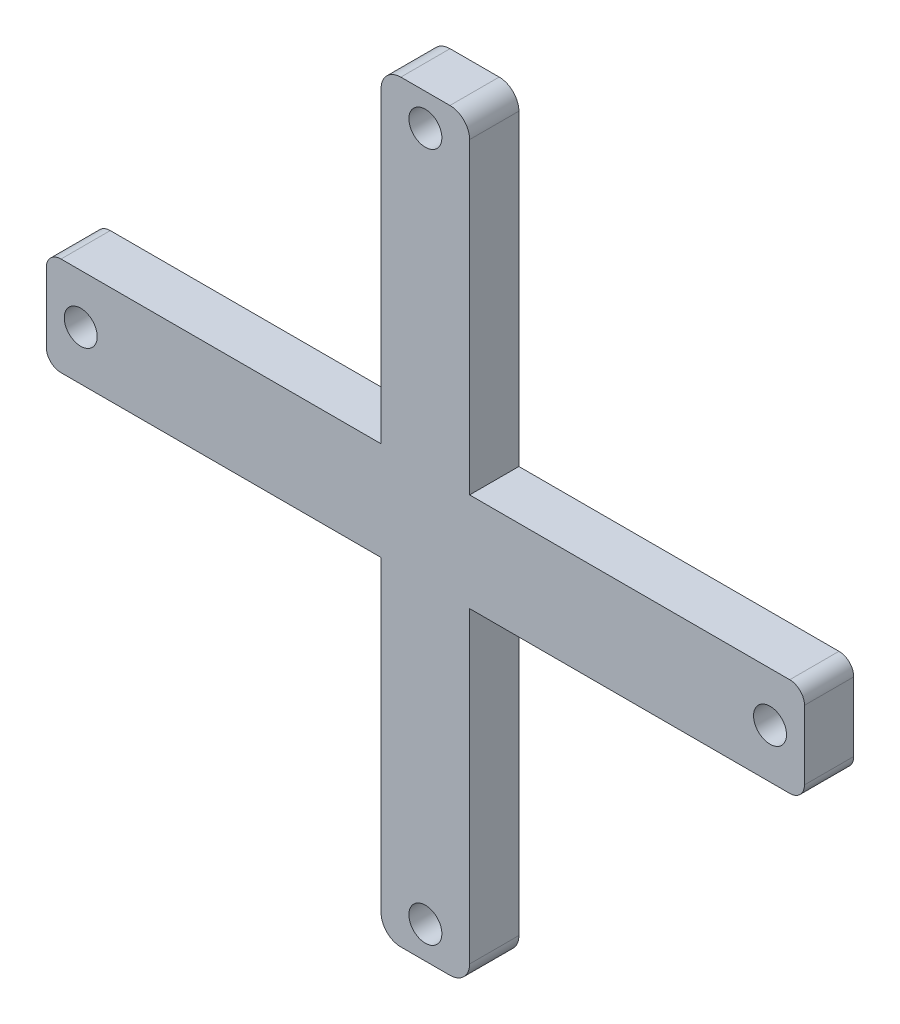
ISO-10303-21;
HEADER;
FILE_DESCRIPTION(('STEP AP214'),'2;1');
FILE_NAME('part.step','',(''),(''),'','','');
FILE_SCHEMA(('AUTOMOTIVE_DESIGN { 1 0 10303 214 1 1 1 1 }'));
ENDSEC;
DATA;
#1=APPLICATION_CONTEXT('core data for automotive mechanical design processes');
#2=APPLICATION_PROTOCOL_DEFINITION('international standard','automotive_design',2000,#1);
#3=PRODUCT_CONTEXT('',#1,'mechanical');
#4=PRODUCT('Part','Part','',(#3));
#5=PRODUCT_RELATED_PRODUCT_CATEGORY('part','',(#4));
#6=PRODUCT_DEFINITION_FORMATION('','',#4);
#7=PRODUCT_DEFINITION_CONTEXT('part definition',#1,'design');
#8=PRODUCT_DEFINITION('design','',#6,#7);
#9=PRODUCT_DEFINITION_SHAPE('','',#8);
#10=(LENGTH_UNIT() NAMED_UNIT(*) SI_UNIT(.MILLI.,.METRE.));
#11=(NAMED_UNIT(*) PLANE_ANGLE_UNIT() SI_UNIT($,.RADIAN.));
#12=(NAMED_UNIT(*) SI_UNIT($,.STERADIAN.) SOLID_ANGLE_UNIT());
#13=UNCERTAINTY_MEASURE_WITH_UNIT(LENGTH_MEASURE(1.E-05),#10,'distance_accuracy_value','');
#14=(GEOMETRIC_REPRESENTATION_CONTEXT(3) GLOBAL_UNCERTAINTY_ASSIGNED_CONTEXT((#13)) GLOBAL_UNIT_ASSIGNED_CONTEXT((#10,
#11,#12)) REPRESENTATION_CONTEXT('',''));
#15=CARTESIAN_POINT('',(0.,0.,0.));
#16=DIRECTION('',(0.,0.,1.));
#17=DIRECTION('',(1.,0.,0.));
#18=AXIS2_PLACEMENT_3D('',#15,#16,#17);
#19=CARTESIAN_POINT('',(-88.9,0.,12.7));
#20=DIRECTION('',(0.,0.,-1.));
#21=DIRECTION('',(-1.,0.,0.));
#22=AXIS2_PLACEMENT_3D('',#19,#20,#21);
#23=CYLINDRICAL_SURFACE('',#22,4.25000000000001);
#24=CARTESIAN_POINT('',(-88.9,0.,12.7));
#25=DIRECTION('',(0.,0.,1.));
#26=DIRECTION('',(1.,0.,0.));
#27=AXIS2_PLACEMENT_3D('',#24,#25,#26);
#28=CIRCLE('',#27,4.25000000000001);
#29=CARTESIAN_POINT('',(-84.65,0.,12.7));
#30=VERTEX_POINT('',#29);
#31=EDGE_CURVE('E262',#30,#30,#28,.T.);
#32=ORIENTED_EDGE('',*,*,#31,.T.);
#33=EDGE_LOOP('',(#32));
#34=FACE_BOUND('',#33,.T.);
#35=CARTESIAN_POINT('',(-88.9,0.,6.35));
#36=DIRECTION('',(0.,0.,-1.));
#37=DIRECTION('',(-1.,0.,0.));
#38=AXIS2_PLACEMENT_3D('',#35,#36,#37);
#39=CIRCLE('',#38,4.25000000000001);
#40=CARTESIAN_POINT('',(-93.15,0.,6.35));
#41=VERTEX_POINT('',#40);
#42=EDGE_CURVE('E583',#41,#41,#39,.T.);
#43=ORIENTED_EDGE('',*,*,#42,.T.);
#44=EDGE_LOOP('',(#43));
#45=FACE_BOUND('',#44,.T.);
#46=ADVANCED_FACE('F37',(#34,#45),#23,.F.);
#47=CARTESIAN_POINT('',(0.,-88.9,0.));
#48=DIRECTION('',(0.,0.,1.));
#49=DIRECTION('',(1.,0.,0.));
#50=AXIS2_PLACEMENT_3D('',#47,#48,#49);
#51=CYLINDRICAL_SURFACE('',#50,4.25);
#52=CARTESIAN_POINT('',(0.,-88.9,12.7));
#53=DIRECTION('',(0.,0.,1.));
#54=DIRECTION('',(1.,0.,0.));
#55=AXIS2_PLACEMENT_3D('',#52,#53,#54);
#56=CIRCLE('',#55,4.25);
#57=CARTESIAN_POINT('',(4.25,-88.9,12.7));
#58=VERTEX_POINT('',#57);
#59=EDGE_CURVE('E587',#58,#58,#56,.T.);
#60=ORIENTED_EDGE('',*,*,#59,.T.);
#61=EDGE_LOOP('',(#60));
#62=FACE_BOUND('',#61,.T.);
#63=CARTESIAN_POINT('',(0.,-88.9,6.35));
#64=DIRECTION('',(0.,0.,-1.));
#65=DIRECTION('',(-1.,0.,0.));
#66=AXIS2_PLACEMENT_3D('',#63,#64,#65);
#67=CIRCLE('',#66,4.25);
#68=CARTESIAN_POINT('',(-4.25,-88.9,6.35));
#69=VERTEX_POINT('',#68);
#70=EDGE_CURVE('E11',#69,#69,#67,.F.);
#71=ORIENTED_EDGE('',*,*,#70,.F.);
#72=EDGE_LOOP('',(#71));
#73=FACE_BOUND('',#72,.T.);
#74=ADVANCED_FACE('F354',(#62,#73),#51,.F.);
#75=CARTESIAN_POINT('',(88.9,0.,12.7));
#76=DIRECTION('',(0.,0.,-1.));
#77=DIRECTION('',(-1.,0.,0.));
#78=AXIS2_PLACEMENT_3D('',#75,#76,#77);
#79=CYLINDRICAL_SURFACE('',#78,4.25000000000001);
#80=CARTESIAN_POINT('',(88.9,0.,12.7));
#81=DIRECTION('',(0.,0.,1.));
#82=DIRECTION('',(1.,0.,0.));
#83=AXIS2_PLACEMENT_3D('',#80,#81,#82);
#84=CIRCLE('',#83,4.25000000000001);
#85=CARTESIAN_POINT('',(93.15,0.,12.7));
#86=VERTEX_POINT('',#85);
#87=EDGE_CURVE('E259',#86,#86,#84,.T.);
#88=ORIENTED_EDGE('',*,*,#87,.T.);
#89=EDGE_LOOP('',(#88));
#90=FACE_BOUND('',#89,.T.);
#91=CARTESIAN_POINT('',(88.9,0.,6.35));
#92=DIRECTION('',(0.,0.,-1.));
#93=DIRECTION('',(-1.,0.,0.));
#94=AXIS2_PLACEMENT_3D('',#91,#92,#93);
#95=CIRCLE('',#94,4.25000000000001);
#96=CARTESIAN_POINT('',(84.65,0.,6.35));
#97=VERTEX_POINT('',#96);
#98=EDGE_CURVE('E584',#97,#97,#95,.T.);
#99=ORIENTED_EDGE('',*,*,#98,.T.);
#100=EDGE_LOOP('',(#99));
#101=FACE_BOUND('',#100,.T.);
#102=ADVANCED_FACE('F344',(#90,#101),#79,.F.);
#103=CARTESIAN_POINT('',(0.,88.9,0.));
#104=DIRECTION('',(0.,0.,1.));
#105=DIRECTION('',(1.,0.,0.));
#106=AXIS2_PLACEMENT_3D('',#103,#104,#105);
#107=CYLINDRICAL_SURFACE('',#106,4.25);
#108=CARTESIAN_POINT('',(0.,88.9,12.7));
#109=DIRECTION('',(0.,0.,1.));
#110=DIRECTION('',(1.,0.,0.));
#111=AXIS2_PLACEMENT_3D('',#108,#109,#110);
#112=CIRCLE('',#111,4.25);
#113=CARTESIAN_POINT('',(4.25,88.9,12.7));
#114=VERTEX_POINT('',#113);
#115=EDGE_CURVE('E207',#114,#114,#112,.T.);
#116=ORIENTED_EDGE('',*,*,#115,.T.);
#117=EDGE_LOOP('',(#116));
#118=FACE_BOUND('',#117,.T.);
#119=CARTESIAN_POINT('',(0.,88.9,6.35));
#120=DIRECTION('',(0.,0.,-1.));
#121=DIRECTION('',(-1.,0.,0.));
#122=AXIS2_PLACEMENT_3D('',#119,#120,#121);
#123=CIRCLE('',#122,4.25);
#124=CARTESIAN_POINT('',(-4.25,88.9,6.35));
#125=VERTEX_POINT('',#124);
#126=EDGE_CURVE('E45',#125,#125,#123,.F.);
#127=ORIENTED_EDGE('',*,*,#126,.F.);
#128=EDGE_LOOP('',(#127));
#129=FACE_BOUND('',#128,.T.);
#130=ADVANCED_FACE('F341',(#118,#129),#107,.F.);
#131=CARTESIAN_POINT('',(93.98,12.7,12.7));
#132=DIRECTION('',(0.,-1.,0.));
#133=DIRECTION('',(1.,0.,0.));
#134=AXIS2_PLACEMENT_3D('',#131,#132,#133);
#135=PLANE('',#134);
#136=DIRECTION('',(-1.,0.,0.));
#137=VECTOR('',#136,1.);
#138=CARTESIAN_POINT('',(93.98,12.7,12.7));
#139=LINE('',#138,#137);
#140=CARTESIAN_POINT('',(-11.4153842055131,12.7,12.7));
#141=VERTEX_POINT('',#140);
#142=CARTESIAN_POINT('',(-93.98,12.7,12.7));
#143=VERTEX_POINT('',#142);
#144=EDGE_CURVE('E269',#141,#143,#139,.T.);
#145=ORIENTED_EDGE('',*,*,#144,.F.);
#146=DIRECTION('',(0.,0.,-1.));
#147=VECTOR('',#146,1.);
#148=CARTESIAN_POINT('',(-11.4153842055131,12.7,12.7));
#149=LINE('',#148,#147);
#150=CARTESIAN_POINT('',(-11.4153842055131,12.7,0.));
#151=VERTEX_POINT('',#150);
#152=EDGE_CURVE('E256',#141,#151,#149,.T.);
#153=ORIENTED_EDGE('',*,*,#152,.T.);
#154=DIRECTION('',(-1.,0.,0.));
#155=VECTOR('',#154,1.);
#156=CARTESIAN_POINT('',(93.98,12.7,0.));
#157=LINE('',#156,#155);
#158=CARTESIAN_POINT('',(-93.98,12.7,0.));
#159=VERTEX_POINT('',#158);
#160=EDGE_CURVE('E291',#151,#159,#157,.T.);
#161=ORIENTED_EDGE('',*,*,#160,.T.);
#162=DIRECTION('',(0.,0.,-1.));
#163=VECTOR('',#162,1.);
#164=CARTESIAN_POINT('',(-93.98,12.7,12.7));
#165=LINE('',#164,#163);
#166=EDGE_CURVE('E325',#143,#159,#165,.T.);
#167=ORIENTED_EDGE('',*,*,#166,.F.);
#168=EDGE_LOOP('',(#145,#153,#161,#167));
#169=FACE_BOUND('',#168,.T.);
#170=ADVANCED_FACE('F343',(#169),#135,.F.);
#171=CARTESIAN_POINT('',(93.98,-12.7,12.7));
#172=DIRECTION('',(0.,1.,0.));
#173=DIRECTION('',(-1.,0.,0.));
#174=AXIS2_PLACEMENT_3D('',#171,#172,#173);
#175=PLANE('',#174);
#176=DIRECTION('',(1.,0.,0.));
#177=VECTOR('',#176,1.);
#178=CARTESIAN_POINT('',(93.98,-12.7,0.));
#179=LINE('',#178,#177);
#180=CARTESIAN_POINT('',(-93.98,-12.7,0.));
#181=VERTEX_POINT('',#180);
#182=CARTESIAN_POINT('',(-11.4153842055131,-12.7,0.));
#183=VERTEX_POINT('',#182);
#184=EDGE_CURVE('E302',#181,#183,#179,.T.);
#185=ORIENTED_EDGE('',*,*,#184,.T.);
#186=DIRECTION('',(0.,0.,1.));
#187=VECTOR('',#186,1.);
#188=CARTESIAN_POINT('',(-11.4153842055131,-12.7,12.7));
#189=LINE('',#188,#187);
#190=CARTESIAN_POINT('',(-11.4153842055131,-12.7,12.7));
#191=VERTEX_POINT('',#190);
#192=EDGE_CURVE('E334',#183,#191,#189,.T.);
#193=ORIENTED_EDGE('',*,*,#192,.T.);
#194=DIRECTION('',(1.,0.,0.));
#195=VECTOR('',#194,1.);
#196=CARTESIAN_POINT('',(93.98,-12.7,12.7));
#197=LINE('',#196,#195);
#198=CARTESIAN_POINT('',(-93.98,-12.7,12.7));
#199=VERTEX_POINT('',#198);
#200=EDGE_CURVE('E281',#199,#191,#197,.T.);
#201=ORIENTED_EDGE('',*,*,#200,.F.);
#202=DIRECTION('',(0.,0.,-1.));
#203=VECTOR('',#202,1.);
#204=CARTESIAN_POINT('',(-93.98,-12.7,12.7));
#205=LINE('',#204,#203);
#206=EDGE_CURVE('E316',#199,#181,#205,.T.);
#207=ORIENTED_EDGE('',*,*,#206,.T.);
#208=EDGE_LOOP('',(#185,#193,#201,#207));
#209=FACE_BOUND('',#208,.T.);
#210=ADVANCED_FACE('F351',(#209),#175,.F.);
#211=CARTESIAN_POINT('',(93.98,8.89000000000001,12.7));
#212=DIRECTION('',(0.,0.,1.));
#213=DIRECTION('',(1.,0.,0.));
#214=AXIS2_PLACEMENT_3D('',#211,#212,#213);
#215=PLANE('',#214);
#216=CARTESIAN_POINT('',(93.98,12.7,12.7));
#217=VERTEX_POINT('',#216);
#218=CARTESIAN_POINT('',(11.4153842055131,12.7,12.7));
#219=VERTEX_POINT('',#218);
#220=EDGE_CURVE('E271',#217,#219,#139,.T.);
#221=ORIENTED_EDGE('',*,*,#220,.T.);
#222=DIRECTION('',(0.,1.,0.));
#223=VECTOR('',#222,1.);
#224=CARTESIAN_POINT('',(11.4153842055131,-92.075,12.7));
#225=LINE('',#224,#223);
#226=CARTESIAN_POINT('',(11.4153842055131,92.075,12.7));
#227=VERTEX_POINT('',#226);
#228=EDGE_CURVE('E230',#219,#227,#225,.T.);
#229=ORIENTED_EDGE('',*,*,#228,.T.);
#230=CARTESIAN_POINT('',(6.33538420551314,92.075,12.7));
#231=DIRECTION('',(0.,0.,1.));
#232=DIRECTION('',(-1.,0.,0.));
#233=AXIS2_PLACEMENT_3D('',#230,#231,#232);
#234=CIRCLE('',#233,5.08000000000001);
#235=CARTESIAN_POINT('',(6.33538420551314,97.155,12.7));
#236=VERTEX_POINT('',#235);
#237=EDGE_CURVE('E232',#227,#236,#234,.T.);
#238=ORIENTED_EDGE('',*,*,#237,.T.);
#239=DIRECTION('',(-1.,0.,0.));
#240=VECTOR('',#239,1.);
#241=CARTESIAN_POINT('',(-6.33538420551314,97.155,12.7));
#242=LINE('',#241,#240);
#243=CARTESIAN_POINT('',(-6.33538420551314,97.155,12.7));
#244=VERTEX_POINT('',#243);
#245=EDGE_CURVE('E235',#236,#244,#242,.T.);
#246=ORIENTED_EDGE('',*,*,#245,.T.);
#247=CARTESIAN_POINT('',(-6.33538420551314,92.075,12.7));
#248=DIRECTION('',(0.,0.,1.));
#249=DIRECTION('',(-1.,0.,0.));
#250=AXIS2_PLACEMENT_3D('',#247,#248,#249);
#251=CIRCLE('',#250,5.08000000000001);
#252=CARTESIAN_POINT('',(-11.4153842055131,92.075,12.7));
#253=VERTEX_POINT('',#252);
#254=EDGE_CURVE('E238',#244,#253,#251,.T.);
#255=ORIENTED_EDGE('',*,*,#254,.T.);
#256=DIRECTION('',(0.,-1.,0.));
#257=VECTOR('',#256,1.);
#258=CARTESIAN_POINT('',(-11.4153842055131,-92.075,12.7));
#259=LINE('',#258,#257);
#260=EDGE_CURVE('E52',#253,#141,#259,.T.);
#261=ORIENTED_EDGE('',*,*,#260,.T.);
#262=ORIENTED_EDGE('',*,*,#144,.T.);
#263=CARTESIAN_POINT('',(-93.98,8.88999999999999,12.7));
#264=DIRECTION('',(0.,0.,1.));
#265=DIRECTION('',(1.,0.,0.));
#266=AXIS2_PLACEMENT_3D('',#263,#264,#265);
#267=CIRCLE('',#266,3.81);
#268=CARTESIAN_POINT('',(-97.79,8.88999999999999,12.7));
#269=VERTEX_POINT('',#268);
#270=EDGE_CURVE('E274',#143,#269,#267,.T.);
#271=ORIENTED_EDGE('',*,*,#270,.T.);
#272=DIRECTION('',(0.,-1.,0.));
#273=VECTOR('',#272,1.);
#274=CARTESIAN_POINT('',(-97.79,-8.89000000000001,12.7));
#275=LINE('',#274,#273);
#276=CARTESIAN_POINT('',(-97.79,-8.89000000000001,12.7));
#277=VERTEX_POINT('',#276);
#278=EDGE_CURVE('E276',#269,#277,#275,.T.);
#279=ORIENTED_EDGE('',*,*,#278,.T.);
#280=CARTESIAN_POINT('',(-93.98,-8.89000000000001,12.7));
#281=DIRECTION('',(0.,0.,1.));
#282=DIRECTION('',(-1.,0.,0.));
#283=AXIS2_PLACEMENT_3D('',#280,#281,#282);
#284=CIRCLE('',#283,3.81);
#285=EDGE_CURVE('E278',#277,#199,#284,.T.);
#286=ORIENTED_EDGE('',*,*,#285,.T.);
#287=ORIENTED_EDGE('',*,*,#200,.T.);
#288=CARTESIAN_POINT('',(-11.4153842055131,-92.075,12.7));
#289=VERTEX_POINT('',#288);
#290=EDGE_CURVE('E204',#191,#289,#259,.T.);
#291=ORIENTED_EDGE('',*,*,#290,.T.);
#292=CARTESIAN_POINT('',(-6.33538420551314,-92.075,12.7));
#293=DIRECTION('',(0.,0.,1.));
#294=DIRECTION('',(-1.,0.,0.));
#295=AXIS2_PLACEMENT_3D('',#292,#293,#294);
#296=CIRCLE('',#295,5.07999999999999);
#297=CARTESIAN_POINT('',(-6.33538420551314,-97.155,12.7));
#298=VERTEX_POINT('',#297);
#299=EDGE_CURVE('E225',#289,#298,#296,.T.);
#300=ORIENTED_EDGE('',*,*,#299,.T.);
#301=DIRECTION('',(1.,0.,0.));
#302=VECTOR('',#301,1.);
#303=CARTESIAN_POINT('',(-6.33538420551314,-97.155,12.7));
#304=LINE('',#303,#302);
#305=CARTESIAN_POINT('',(6.33538420551314,-97.155,12.7));
#306=VERTEX_POINT('',#305);
#307=EDGE_CURVE('E180',#298,#306,#304,.T.);
#308=ORIENTED_EDGE('',*,*,#307,.T.);
#309=CARTESIAN_POINT('',(6.33538420551314,-92.075,12.7));
#310=DIRECTION('',(0.,0.,1.));
#311=DIRECTION('',(1.,0.,0.));
#312=AXIS2_PLACEMENT_3D('',#309,#310,#311);
#313=CIRCLE('',#312,5.07999999999999);
#314=CARTESIAN_POINT('',(11.4153842055131,-92.075,12.7));
#315=VERTEX_POINT('',#314);
#316=EDGE_CURVE('E228',#306,#315,#313,.T.);
#317=ORIENTED_EDGE('',*,*,#316,.T.);
#318=CARTESIAN_POINT('',(11.4153842055131,-12.7,12.7));
#319=VERTEX_POINT('',#318);
#320=EDGE_CURVE('E59',#315,#319,#225,.T.);
#321=ORIENTED_EDGE('',*,*,#320,.T.);
#322=CARTESIAN_POINT('',(93.98,-12.7,12.7));
#323=VERTEX_POINT('',#322);
#324=EDGE_CURVE('E280',#319,#323,#197,.T.);
#325=ORIENTED_EDGE('',*,*,#324,.T.);
#326=CARTESIAN_POINT('',(93.98,-8.88999999999999,12.7));
#327=DIRECTION('',(0.,0.,1.));
#328=DIRECTION('',(1.,0.,0.));
#329=AXIS2_PLACEMENT_3D('',#326,#327,#328);
#330=CIRCLE('',#329,3.81);
#331=CARTESIAN_POINT('',(97.79,-8.88999999999999,12.7));
#332=VERTEX_POINT('',#331);
#333=EDGE_CURVE('E284',#323,#332,#330,.T.);
#334=ORIENTED_EDGE('',*,*,#333,.T.);
#335=DIRECTION('',(0.,1.,0.));
#336=VECTOR('',#335,1.);
#337=CARTESIAN_POINT('',(97.79,-8.88999999999999,12.7));
#338=LINE('',#337,#336);
#339=CARTESIAN_POINT('',(97.79,8.89000000000001,12.7));
#340=VERTEX_POINT('',#339);
#341=EDGE_CURVE('E286',#332,#340,#338,.T.);
#342=ORIENTED_EDGE('',*,*,#341,.T.);
#343=CARTESIAN_POINT('',(93.98,8.89000000000001,12.7));
#344=DIRECTION('',(0.,0.,1.));
#345=DIRECTION('',(1.,0.,0.));
#346=AXIS2_PLACEMENT_3D('',#343,#344,#345);
#347=CIRCLE('',#346,3.81);
#348=EDGE_CURVE('E266',#340,#217,#347,.T.);
#349=ORIENTED_EDGE('',*,*,#348,.T.);
#350=EDGE_LOOP('',(#221,#229,#238,#246,#255,#261,#262,#271,#279,#286,#287,#291,#300,#308,#317,
#321,#325,#334,#342,#349));
#351=FACE_BOUND('',#350,.T.);
#352=ORIENTED_EDGE('',*,*,#87,.F.);
#353=EDGE_LOOP('',(#352));
#354=FACE_BOUND('',#353,.T.);
#355=ORIENTED_EDGE('',*,*,#59,.F.);
#356=EDGE_LOOP('',(#355));
#357=FACE_BOUND('',#356,.T.);
#358=ORIENTED_EDGE('',*,*,#115,.F.);
#359=EDGE_LOOP('',(#358));
#360=FACE_BOUND('',#359,.T.);
#361=ORIENTED_EDGE('',*,*,#31,.F.);
#362=EDGE_LOOP('',(#361));
#363=FACE_BOUND('',#362,.T.);
#364=ADVANCED_FACE('F370',(#351,#354,#357,#360,#363),#215,.T.);
#365=CARTESIAN_POINT('',(93.98,8.89000000000001,0.));
#366=DIRECTION('',(0.,0.,1.));
#367=DIRECTION('',(1.,0.,0.));
#368=AXIS2_PLACEMENT_3D('',#365,#366,#367);
#369=PLANE('',#368);
#370=CARTESIAN_POINT('',(11.4153842055131,-12.7,0.));
#371=VERTEX_POINT('',#370);
#372=CARTESIAN_POINT('',(93.98,-12.7,0.));
#373=VERTEX_POINT('',#372);
#374=EDGE_CURVE('E301',#371,#373,#179,.T.);
#375=ORIENTED_EDGE('',*,*,#374,.F.);
#376=DIRECTION('',(0.,1.,0.));
#377=VECTOR('',#376,1.);
#378=CARTESIAN_POINT('',(11.4153842055131,-92.075,0.));
#379=LINE('',#378,#377);
#380=CARTESIAN_POINT('',(11.4153842055131,-92.075,0.));
#381=VERTEX_POINT('',#380);
#382=EDGE_CURVE('E212',#381,#371,#379,.T.);
#383=ORIENTED_EDGE('',*,*,#382,.F.);
#384=CARTESIAN_POINT('',(6.33538420551314,-92.075,0.));
#385=DIRECTION('',(0.,0.,1.));
#386=DIRECTION('',(1.,0.,0.));
#387=AXIS2_PLACEMENT_3D('',#384,#385,#386);
#388=CIRCLE('',#387,5.07999999999999);
#389=CARTESIAN_POINT('',(6.33538420551314,-97.155,0.));
#390=VERTEX_POINT('',#389);
#391=EDGE_CURVE('E197',#390,#381,#388,.T.);
#392=ORIENTED_EDGE('',*,*,#391,.F.);
#393=DIRECTION('',(1.,0.,0.));
#394=VECTOR('',#393,1.);
#395=CARTESIAN_POINT('',(-6.33538420551314,-97.155,0.));
#396=LINE('',#395,#394);
#397=CARTESIAN_POINT('',(-6.33538420551314,-97.155,0.));
#398=VERTEX_POINT('',#397);
#399=EDGE_CURVE('E178',#398,#390,#396,.T.);
#400=ORIENTED_EDGE('',*,*,#399,.F.);
#401=CARTESIAN_POINT('',(-6.33538420551314,-92.075,0.));
#402=DIRECTION('',(0.,0.,1.));
#403=DIRECTION('',(-1.,0.,0.));
#404=AXIS2_PLACEMENT_3D('',#401,#402,#403);
#405=CIRCLE('',#404,5.07999999999999);
#406=CARTESIAN_POINT('',(-11.4153842055131,-92.075,0.));
#407=VERTEX_POINT('',#406);
#408=EDGE_CURVE('E194',#407,#398,#405,.T.);
#409=ORIENTED_EDGE('',*,*,#408,.F.);
#410=DIRECTION('',(0.,-1.,0.));
#411=VECTOR('',#410,1.);
#412=CARTESIAN_POINT('',(-11.4153842055131,-92.075,0.));
#413=LINE('',#412,#411);
#414=EDGE_CURVE('E223',#183,#407,#413,.T.);
#415=ORIENTED_EDGE('',*,*,#414,.F.);
#416=ORIENTED_EDGE('',*,*,#184,.F.);
#417=CARTESIAN_POINT('',(-93.98,-8.89000000000001,0.));
#418=DIRECTION('',(0.,0.,1.));
#419=DIRECTION('',(-1.,0.,0.));
#420=AXIS2_PLACEMENT_3D('',#417,#418,#419);
#421=CIRCLE('',#420,3.81);
#422=CARTESIAN_POINT('',(-97.79,-8.89000000000001,0.));
#423=VERTEX_POINT('',#422);
#424=EDGE_CURVE('E299',#423,#181,#421,.T.);
#425=ORIENTED_EDGE('',*,*,#424,.F.);
#426=DIRECTION('',(0.,-1.,0.));
#427=VECTOR('',#426,1.);
#428=CARTESIAN_POINT('',(-97.79,-8.89000000000001,0.));
#429=LINE('',#428,#427);
#430=CARTESIAN_POINT('',(-97.79,8.88999999999999,0.));
#431=VERTEX_POINT('',#430);
#432=EDGE_CURVE('E297',#431,#423,#429,.T.);
#433=ORIENTED_EDGE('',*,*,#432,.F.);
#434=CARTESIAN_POINT('',(-93.98,8.88999999999999,0.));
#435=DIRECTION('',(0.,0.,1.));
#436=DIRECTION('',(1.,0.,0.));
#437=AXIS2_PLACEMENT_3D('',#434,#435,#436);
#438=CIRCLE('',#437,3.81);
#439=EDGE_CURVE('E295',#159,#431,#438,.T.);
#440=ORIENTED_EDGE('',*,*,#439,.F.);
#441=ORIENTED_EDGE('',*,*,#160,.F.);
#442=CARTESIAN_POINT('',(-11.4153842055131,92.075,0.));
#443=VERTEX_POINT('',#442);
#444=EDGE_CURVE('E186',#443,#151,#413,.T.);
#445=ORIENTED_EDGE('',*,*,#444,.F.);
#446=CARTESIAN_POINT('',(-6.33538420551314,92.075,0.));
#447=DIRECTION('',(0.,0.,1.));
#448=DIRECTION('',(-1.,0.,0.));
#449=AXIS2_PLACEMENT_3D('',#446,#447,#448);
#450=CIRCLE('',#449,5.08000000000001);
#451=CARTESIAN_POINT('',(-6.33538420551314,97.155,0.));
#452=VERTEX_POINT('',#451);
#453=EDGE_CURVE('E220',#452,#443,#450,.T.);
#454=ORIENTED_EDGE('',*,*,#453,.F.);
#455=DIRECTION('',(-1.,0.,0.));
#456=VECTOR('',#455,1.);
#457=CARTESIAN_POINT('',(-6.33538420551314,97.155,0.));
#458=LINE('',#457,#456);
#459=CARTESIAN_POINT('',(6.33538420551314,97.155,0.));
#460=VERTEX_POINT('',#459);
#461=EDGE_CURVE('E217',#460,#452,#458,.T.);
#462=ORIENTED_EDGE('',*,*,#461,.F.);
#463=CARTESIAN_POINT('',(6.33538420551314,92.075,0.));
#464=DIRECTION('',(0.,0.,1.));
#465=DIRECTION('',(-1.,0.,0.));
#466=AXIS2_PLACEMENT_3D('',#463,#464,#465);
#467=CIRCLE('',#466,5.08000000000001);
#468=CARTESIAN_POINT('',(11.4153842055131,92.075,0.));
#469=VERTEX_POINT('',#468);
#470=EDGE_CURVE('E214',#469,#460,#467,.T.);
#471=ORIENTED_EDGE('',*,*,#470,.F.);
#472=CARTESIAN_POINT('',(11.4153842055131,12.7,0.));
#473=VERTEX_POINT('',#472);
#474=EDGE_CURVE('E211',#473,#469,#379,.T.);
#475=ORIENTED_EDGE('',*,*,#474,.F.);
#476=CARTESIAN_POINT('',(93.98,12.7,0.));
#477=VERTEX_POINT('',#476);
#478=EDGE_CURVE('E292',#477,#473,#157,.T.);
#479=ORIENTED_EDGE('',*,*,#478,.F.);
#480=CARTESIAN_POINT('',(93.98,8.89000000000001,0.));
#481=DIRECTION('',(0.,0.,1.));
#482=DIRECTION('',(1.,0.,0.));
#483=AXIS2_PLACEMENT_3D('',#480,#481,#482);
#484=CIRCLE('',#483,3.81);
#485=CARTESIAN_POINT('',(97.79,8.89000000000001,0.));
#486=VERTEX_POINT('',#485);
#487=EDGE_CURVE('E265',#486,#477,#484,.T.);
#488=ORIENTED_EDGE('',*,*,#487,.F.);
#489=DIRECTION('',(0.,1.,0.));
#490=VECTOR('',#489,1.);
#491=CARTESIAN_POINT('',(97.79,-8.88999999999999,0.));
#492=LINE('',#491,#490);
#493=CARTESIAN_POINT('',(97.79,-8.88999999999999,0.));
#494=VERTEX_POINT('',#493);
#495=EDGE_CURVE('E270',#494,#486,#492,.T.);
#496=ORIENTED_EDGE('',*,*,#495,.F.);
#497=CARTESIAN_POINT('',(93.98,-8.88999999999999,0.));
#498=DIRECTION('',(0.,0.,1.));
#499=DIRECTION('',(1.,0.,0.));
#500=AXIS2_PLACEMENT_3D('',#497,#498,#499);
#501=CIRCLE('',#500,3.81);
#502=EDGE_CURVE('E305',#373,#494,#501,.T.);
#503=ORIENTED_EDGE('',*,*,#502,.F.);
#504=EDGE_LOOP('',(#375,#383,#392,#400,#409,#415,#416,#425,#433,#440,#441,#445,#454,#462,#471,
#475,#479,#488,#496,#503));
#505=FACE_BOUND('',#504,.T.);
#506=ADVANCED_FACE('F192',(#505),#369,.F.);
#507=CARTESIAN_POINT('',(93.98,8.89000000000001,12.7));
#508=DIRECTION('',(0.,0.,-1.));
#509=DIRECTION('',(-1.,0.,0.));
#510=AXIS2_PLACEMENT_3D('',#507,#508,#509);
#511=CYLINDRICAL_SURFACE('',#510,3.81);
#512=ORIENTED_EDGE('',*,*,#487,.T.);
#513=DIRECTION('',(0.,0.,-1.));
#514=VECTOR('',#513,1.);
#515=CARTESIAN_POINT('',(93.98,12.7,12.7));
#516=LINE('',#515,#514);
#517=EDGE_CURVE('E328',#217,#477,#516,.T.);
#518=ORIENTED_EDGE('',*,*,#517,.F.);
#519=ORIENTED_EDGE('',*,*,#348,.F.);
#520=DIRECTION('',(0.,0.,-1.));
#521=VECTOR('',#520,1.);
#522=CARTESIAN_POINT('',(97.79,8.89000000000001,12.7));
#523=LINE('',#522,#521);
#524=EDGE_CURVE('E288',#340,#486,#523,.T.);
#525=ORIENTED_EDGE('',*,*,#524,.T.);
#526=EDGE_LOOP('',(#512,#518,#519,#525));
#527=FACE_BOUND('',#526,.T.);
#528=ADVANCED_FACE('F39',(#527),#511,.T.);
#529=ORIENTED_EDGE('',*,*,#478,.T.);
#530=DIRECTION('',(0.,0.,1.));
#531=VECTOR('',#530,1.);
#532=CARTESIAN_POINT('',(11.4153842055131,12.7,12.7));
#533=LINE('',#532,#531);
#534=EDGE_CURVE('E241',#473,#219,#533,.T.);
#535=ORIENTED_EDGE('',*,*,#534,.T.);
#536=ORIENTED_EDGE('',*,*,#220,.F.);
#537=ORIENTED_EDGE('',*,*,#517,.T.);
#538=EDGE_LOOP('',(#529,#535,#536,#537));
#539=FACE_BOUND('',#538,.T.);
#540=ADVANCED_FACE('F353',(#539),#135,.F.);
#541=CARTESIAN_POINT('',(-93.98,8.88999999999999,12.7));
#542=DIRECTION('',(0.,0.,-1.));
#543=DIRECTION('',(-1.,0.,0.));
#544=AXIS2_PLACEMENT_3D('',#541,#542,#543);
#545=CYLINDRICAL_SURFACE('',#544,3.81);
#546=ORIENTED_EDGE('',*,*,#439,.T.);
#547=DIRECTION('',(0.,0.,-1.));
#548=VECTOR('',#547,1.);
#549=CARTESIAN_POINT('',(-97.79,8.88999999999999,12.7));
#550=LINE('',#549,#548);
#551=EDGE_CURVE('E322',#269,#431,#550,.T.);
#552=ORIENTED_EDGE('',*,*,#551,.F.);
#553=ORIENTED_EDGE('',*,*,#270,.F.);
#554=ORIENTED_EDGE('',*,*,#166,.T.);
#555=EDGE_LOOP('',(#546,#552,#553,#554));
#556=FACE_BOUND('',#555,.T.);
#557=ADVANCED_FACE('F395',(#556),#545,.T.);
#558=CARTESIAN_POINT('',(-97.79,-8.89000000000001,12.7));
#559=DIRECTION('',(1.,0.,0.));
#560=DIRECTION('',(0.,0.,-1.));
#561=AXIS2_PLACEMENT_3D('',#558,#559,#560);
#562=PLANE('',#561);
#563=ORIENTED_EDGE('',*,*,#432,.T.);
#564=DIRECTION('',(0.,0.,-1.));
#565=VECTOR('',#564,1.);
#566=CARTESIAN_POINT('',(-97.79,-8.89000000000001,12.7));
#567=LINE('',#566,#565);
#568=EDGE_CURVE('E319',#277,#423,#567,.T.);
#569=ORIENTED_EDGE('',*,*,#568,.F.);
#570=ORIENTED_EDGE('',*,*,#278,.F.);
#571=ORIENTED_EDGE('',*,*,#551,.T.);
#572=EDGE_LOOP('',(#563,#569,#570,#571));
#573=FACE_BOUND('',#572,.T.);
#574=ADVANCED_FACE('F391',(#573),#562,.F.);
#575=CARTESIAN_POINT('',(-93.98,-8.89000000000001,12.7));
#576=DIRECTION('',(0.,0.,-1.));
#577=DIRECTION('',(-1.,0.,0.));
#578=AXIS2_PLACEMENT_3D('',#575,#576,#577);
#579=CYLINDRICAL_SURFACE('',#578,3.81);
#580=ORIENTED_EDGE('',*,*,#424,.T.);
#581=ORIENTED_EDGE('',*,*,#206,.F.);
#582=ORIENTED_EDGE('',*,*,#285,.F.);
#583=ORIENTED_EDGE('',*,*,#568,.T.);
#584=EDGE_LOOP('',(#580,#581,#582,#583));
#585=FACE_BOUND('',#584,.T.);
#586=ADVANCED_FACE('F387',(#585),#579,.T.);
#587=ORIENTED_EDGE('',*,*,#324,.F.);
#588=DIRECTION('',(0.,0.,-1.));
#589=VECTOR('',#588,1.);
#590=CARTESIAN_POINT('',(11.4153842055131,-12.7,12.7));
#591=LINE('',#590,#589);
#592=EDGE_CURVE('E331',#319,#371,#591,.T.);
#593=ORIENTED_EDGE('',*,*,#592,.T.);
#594=ORIENTED_EDGE('',*,*,#374,.T.);
#595=DIRECTION('',(0.,0.,-1.));
#596=VECTOR('',#595,1.);
#597=CARTESIAN_POINT('',(93.98,-12.7,12.7));
#598=LINE('',#597,#596);
#599=EDGE_CURVE('E313',#323,#373,#598,.T.);
#600=ORIENTED_EDGE('',*,*,#599,.F.);
#601=EDGE_LOOP('',(#587,#593,#594,#600));
#602=FACE_BOUND('',#601,.T.);
#603=ADVANCED_FACE('F383',(#602),#175,.F.);
#604=CARTESIAN_POINT('',(93.98,-8.88999999999999,12.7));
#605=DIRECTION('',(0.,0.,-1.));
#606=DIRECTION('',(-1.,0.,0.));
#607=AXIS2_PLACEMENT_3D('',#604,#605,#606);
#608=CYLINDRICAL_SURFACE('',#607,3.81);
#609=ORIENTED_EDGE('',*,*,#502,.T.);
#610=DIRECTION('',(0.,0.,-1.));
#611=VECTOR('',#610,1.);
#612=CARTESIAN_POINT('',(97.79,-8.88999999999999,12.7));
#613=LINE('',#612,#611);
#614=EDGE_CURVE('E310',#332,#494,#613,.T.);
#615=ORIENTED_EDGE('',*,*,#614,.F.);
#616=ORIENTED_EDGE('',*,*,#333,.F.);
#617=ORIENTED_EDGE('',*,*,#599,.T.);
#618=EDGE_LOOP('',(#609,#615,#616,#617));
#619=FACE_BOUND('',#618,.T.);
#620=ADVANCED_FACE('F379',(#619),#608,.T.);
#621=CARTESIAN_POINT('',(97.79,-8.88999999999999,12.7));
#622=DIRECTION('',(-1.,0.,0.));
#623=DIRECTION('',(0.,0.,1.));
#624=AXIS2_PLACEMENT_3D('',#621,#622,#623);
#625=PLANE('',#624);
#626=ORIENTED_EDGE('',*,*,#495,.T.);
#627=ORIENTED_EDGE('',*,*,#524,.F.);
#628=ORIENTED_EDGE('',*,*,#341,.F.);
#629=ORIENTED_EDGE('',*,*,#614,.T.);
#630=EDGE_LOOP('',(#626,#627,#628,#629));
#631=FACE_BOUND('',#630,.T.);
#632=ADVANCED_FACE('F375',(#631),#625,.F.);
#633=CARTESIAN_POINT('',(6.33538420551314,-92.075,0.));
#634=DIRECTION('',(0.,0.,1.));
#635=DIRECTION('',(1.,0.,0.));
#636=AXIS2_PLACEMENT_3D('',#633,#634,#635);
#637=CYLINDRICAL_SURFACE('',#636,5.07999999999999);
#638=ORIENTED_EDGE('',*,*,#316,.F.);
#639=DIRECTION('',(0.,0.,1.));
#640=VECTOR('',#639,1.);
#641=CARTESIAN_POINT('',(6.33538420551314,-97.155,0.));
#642=LINE('',#641,#640);
#643=EDGE_CURVE('E185',#390,#306,#642,.T.);
#644=ORIENTED_EDGE('',*,*,#643,.F.);
#645=ORIENTED_EDGE('',*,*,#391,.T.);
#646=DIRECTION('',(0.,0.,1.));
#647=VECTOR('',#646,1.);
#648=CARTESIAN_POINT('',(11.4153842055131,-92.075,0.));
#649=LINE('',#648,#647);
#650=EDGE_CURVE('E251',#381,#315,#649,.T.);
#651=ORIENTED_EDGE('',*,*,#650,.T.);
#652=EDGE_LOOP('',(#638,#644,#645,#651));
#653=FACE_BOUND('',#652,.T.);
#654=ADVANCED_FACE('F378',(#653),#637,.T.);
#655=CARTESIAN_POINT('',(-6.33538420551314,-97.155,0.));
#656=DIRECTION('',(0.,-1.,0.));
#657=DIRECTION('',(0.,0.,-1.));
#658=AXIS2_PLACEMENT_3D('',#655,#656,#657);
#659=PLANE('',#658);
#660=ORIENTED_EDGE('',*,*,#307,.F.);
#661=DIRECTION('',(0.,0.,1.));
#662=VECTOR('',#661,1.);
#663=CARTESIAN_POINT('',(-6.33538420551314,-97.155,0.));
#664=LINE('',#663,#662);
#665=EDGE_CURVE('E175',#398,#298,#664,.T.);
#666=ORIENTED_EDGE('',*,*,#665,.F.);
#667=ORIENTED_EDGE('',*,*,#399,.T.);
#668=ORIENTED_EDGE('',*,*,#643,.T.);
#669=EDGE_LOOP('',(#660,#666,#667,#668));
#670=FACE_BOUND('',#669,.T.);
#671=ADVANCED_FACE('F177',(#670),#659,.T.);
#672=CARTESIAN_POINT('',(-6.33538420551314,-92.075,0.));
#673=DIRECTION('',(0.,0.,1.));
#674=DIRECTION('',(1.,0.,0.));
#675=AXIS2_PLACEMENT_3D('',#672,#673,#674);
#676=CYLINDRICAL_SURFACE('',#675,5.07999999999999);
#677=ORIENTED_EDGE('',*,*,#299,.F.);
#678=DIRECTION('',(0.,0.,1.));
#679=VECTOR('',#678,1.);
#680=CARTESIAN_POINT('',(-11.4153842055131,-92.075,0.));
#681=LINE('',#680,#679);
#682=EDGE_CURVE('E202',#407,#289,#681,.T.);
#683=ORIENTED_EDGE('',*,*,#682,.F.);
#684=ORIENTED_EDGE('',*,*,#408,.T.);
#685=ORIENTED_EDGE('',*,*,#665,.T.);
#686=EDGE_LOOP('',(#677,#683,#684,#685));
#687=FACE_BOUND('',#686,.T.);
#688=ADVANCED_FACE('F200',(#687),#676,.T.);
#689=CARTESIAN_POINT('',(11.4153842055131,-92.075,0.));
#690=DIRECTION('',(1.,0.,0.));
#691=DIRECTION('',(0.,0.,-1.));
#692=AXIS2_PLACEMENT_3D('',#689,#690,#691);
#693=PLANE('',#692);
#694=ORIENTED_EDGE('',*,*,#592,.F.);
#695=ORIENTED_EDGE('',*,*,#320,.F.);
#696=ORIENTED_EDGE('',*,*,#650,.F.);
#697=ORIENTED_EDGE('',*,*,#382,.T.);
#698=EDGE_LOOP('',(#694,#695,#696,#697));
#699=FACE_BOUND('',#698,.T.);
#700=ADVANCED_FACE('F428',(#699),#693,.T.);
#701=CARTESIAN_POINT('',(-11.4153842055131,-92.075,0.));
#702=DIRECTION('',(-1.,0.,0.));
#703=DIRECTION('',(0.,0.,1.));
#704=AXIS2_PLACEMENT_3D('',#701,#702,#703);
#705=PLANE('',#704);
#706=ORIENTED_EDGE('',*,*,#192,.F.);
#707=ORIENTED_EDGE('',*,*,#414,.T.);
#708=ORIENTED_EDGE('',*,*,#682,.T.);
#709=ORIENTED_EDGE('',*,*,#290,.F.);
#710=EDGE_LOOP('',(#706,#707,#708,#709));
#711=FACE_BOUND('',#710,.T.);
#712=ADVANCED_FACE('F433',(#711),#705,.T.);
#713=ORIENTED_EDGE('',*,*,#152,.F.);
#714=ORIENTED_EDGE('',*,*,#260,.F.);
#715=DIRECTION('',(0.,0.,1.));
#716=VECTOR('',#715,1.);
#717=CARTESIAN_POINT('',(-11.4153842055131,92.075,0.));
#718=LINE('',#717,#716);
#719=EDGE_CURVE('E242',#443,#253,#718,.T.);
#720=ORIENTED_EDGE('',*,*,#719,.F.);
#721=ORIENTED_EDGE('',*,*,#444,.T.);
#722=EDGE_LOOP('',(#713,#714,#720,#721));
#723=FACE_BOUND('',#722,.T.);
#724=ADVANCED_FACE('F451',(#723),#705,.T.);
#725=ORIENTED_EDGE('',*,*,#534,.F.);
#726=ORIENTED_EDGE('',*,*,#474,.T.);
#727=DIRECTION('',(0.,0.,1.));
#728=VECTOR('',#727,1.);
#729=CARTESIAN_POINT('',(11.4153842055131,92.075,0.));
#730=LINE('',#729,#728);
#731=EDGE_CURVE('E248',#469,#227,#730,.T.);
#732=ORIENTED_EDGE('',*,*,#731,.T.);
#733=ORIENTED_EDGE('',*,*,#228,.F.);
#734=EDGE_LOOP('',(#725,#726,#732,#733));
#735=FACE_BOUND('',#734,.T.);
#736=ADVANCED_FACE('F413',(#735),#693,.T.);
#737=CARTESIAN_POINT('',(-6.33538420551314,92.075,0.));
#738=DIRECTION('',(0.,0.,1.));
#739=DIRECTION('',(1.,0.,0.));
#740=AXIS2_PLACEMENT_3D('',#737,#738,#739);
#741=CYLINDRICAL_SURFACE('',#740,5.08000000000001);
#742=ORIENTED_EDGE('',*,*,#254,.F.);
#743=DIRECTION('',(0.,0.,1.));
#744=VECTOR('',#743,1.);
#745=CARTESIAN_POINT('',(-6.33538420551314,97.155,0.));
#746=LINE('',#745,#744);
#747=EDGE_CURVE('E244',#452,#244,#746,.T.);
#748=ORIENTED_EDGE('',*,*,#747,.F.);
#749=ORIENTED_EDGE('',*,*,#453,.T.);
#750=ORIENTED_EDGE('',*,*,#719,.T.);
#751=EDGE_LOOP('',(#742,#748,#749,#750));
#752=FACE_BOUND('',#751,.T.);
#753=ADVANCED_FACE('F454',(#752),#741,.T.);
#754=CARTESIAN_POINT('',(-6.33538420551314,97.155,0.));
#755=DIRECTION('',(0.,1.,0.));
#756=DIRECTION('',(0.,0.,1.));
#757=AXIS2_PLACEMENT_3D('',#754,#755,#756);
#758=PLANE('',#757);
#759=ORIENTED_EDGE('',*,*,#245,.F.);
#760=DIRECTION('',(0.,0.,1.));
#761=VECTOR('',#760,1.);
#762=CARTESIAN_POINT('',(6.33538420551314,97.155,0.));
#763=LINE('',#762,#761);
#764=EDGE_CURVE('E246',#460,#236,#763,.T.);
#765=ORIENTED_EDGE('',*,*,#764,.F.);
#766=ORIENTED_EDGE('',*,*,#461,.T.);
#767=ORIENTED_EDGE('',*,*,#747,.T.);
#768=EDGE_LOOP('',(#759,#765,#766,#767));
#769=FACE_BOUND('',#768,.T.);
#770=ADVANCED_FACE('F456',(#769),#758,.T.);
#771=CARTESIAN_POINT('',(6.33538420551314,92.075,0.));
#772=DIRECTION('',(0.,0.,1.));
#773=DIRECTION('',(1.,0.,0.));
#774=AXIS2_PLACEMENT_3D('',#771,#772,#773);
#775=CYLINDRICAL_SURFACE('',#774,5.08000000000001);
#776=ORIENTED_EDGE('',*,*,#237,.F.);
#777=ORIENTED_EDGE('',*,*,#731,.F.);
#778=ORIENTED_EDGE('',*,*,#470,.T.);
#779=ORIENTED_EDGE('',*,*,#764,.T.);
#780=EDGE_LOOP('',(#776,#777,#778,#779));
#781=FACE_BOUND('',#780,.T.);
#782=ADVANCED_FACE('F416',(#781),#775,.T.);
#783=CARTESIAN_POINT('',(0.,88.9,6.35));
#784=DIRECTION('',(0.,0.,-1.));
#785=DIRECTION('',(-1.,0.,0.));
#786=AXIS2_PLACEMENT_3D('',#783,#784,#785);
#787=PLANE('',#786);
#788=ORIENTED_EDGE('',*,*,#126,.T.);
#789=EDGE_LOOP('',(#788));
#790=FACE_BOUND('',#789,.T.);
#791=ADVANCED_FACE('F339',(#790),#787,.F.);
#792=CARTESIAN_POINT('',(88.9,0.,6.35));
#793=DIRECTION('',(0.,0.,-1.));
#794=DIRECTION('',(-1.,0.,0.));
#795=AXIS2_PLACEMENT_3D('',#792,#793,#794);
#796=PLANE('',#795);
#797=ORIENTED_EDGE('',*,*,#98,.F.);
#798=EDGE_LOOP('',(#797));
#799=FACE_BOUND('',#798,.T.);
#800=ADVANCED_FACE('F541',(#799),#796,.F.);
#801=CARTESIAN_POINT('',(0.,-88.9,6.35));
#802=DIRECTION('',(0.,0.,-1.));
#803=DIRECTION('',(-1.,0.,0.));
#804=AXIS2_PLACEMENT_3D('',#801,#802,#803);
#805=PLANE('',#804);
#806=ORIENTED_EDGE('',*,*,#70,.T.);
#807=EDGE_LOOP('',(#806));
#808=FACE_BOUND('',#807,.T.);
#809=ADVANCED_FACE('F550',(#808),#805,.F.);
#810=CARTESIAN_POINT('',(-88.9,0.,6.35));
#811=DIRECTION('',(0.,0.,-1.));
#812=DIRECTION('',(-1.,0.,0.));
#813=AXIS2_PLACEMENT_3D('',#810,#811,#812);
#814=PLANE('',#813);
#815=ORIENTED_EDGE('',*,*,#42,.F.);
#816=EDGE_LOOP('',(#815));
#817=FACE_BOUND('',#816,.T.);
#818=ADVANCED_FACE('F561',(#817),#814,.F.);
#819=CLOSED_SHELL('',(#46,#74,#102,#130,#170,#210,#364,#506,#528,#540,#557,#574,#586,#603,#620,
#632,#654,#671,#688,#700,#712,#724,#736,#753,#770,#782,#791,#800,#809,#818));
#820=MANIFOLD_SOLID_BREP('B2',#819);
#821=ADVANCED_BREP_SHAPE_REPRESENTATION('',(#18,#820),#14);
#822=SHAPE_DEFINITION_REPRESENTATION(#9,#821);
ENDSEC;
END-ISO-10303-21;
